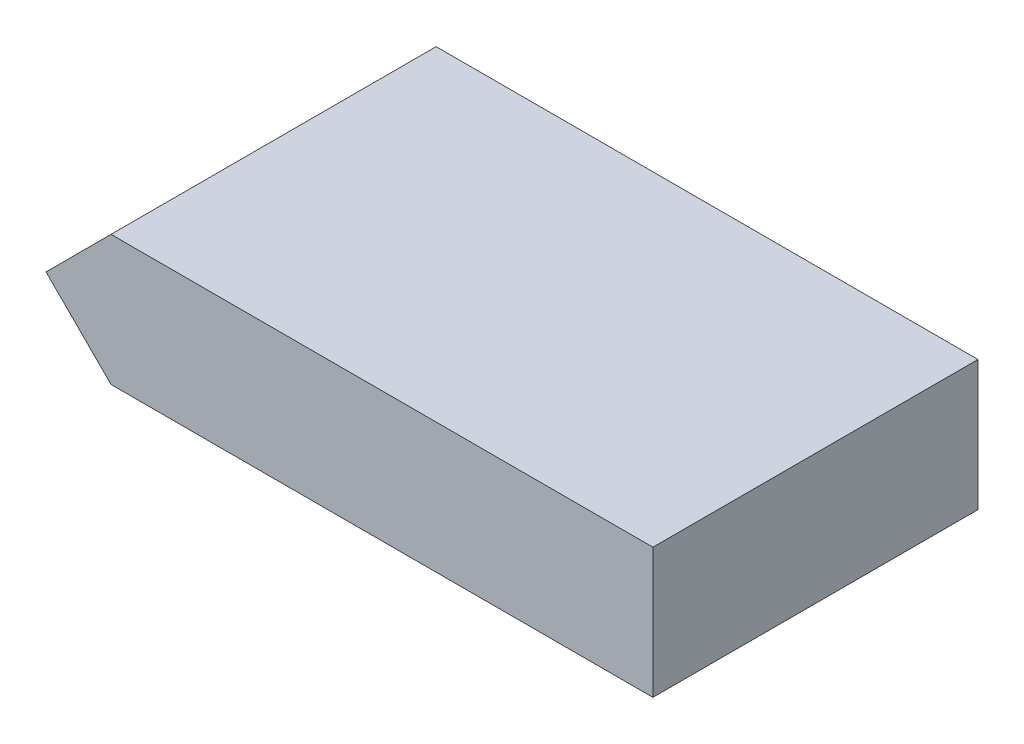
ISO-10303-21;
HEADER;
FILE_DESCRIPTION(('STEP AP214'),'2;1');
FILE_NAME('part.step','',(''),(''),'','','');
FILE_SCHEMA(('AUTOMOTIVE_DESIGN { 1 0 10303 214 1 1 1 1 }'));
ENDSEC;
DATA;
#1=APPLICATION_CONTEXT('core data for automotive mechanical design processes');
#2=APPLICATION_PROTOCOL_DEFINITION('international standard','automotive_design',2000,#1);
#3=PRODUCT_CONTEXT('',#1,'mechanical');
#4=PRODUCT('Part','Part','',(#3));
#5=PRODUCT_RELATED_PRODUCT_CATEGORY('part','',(#4));
#6=PRODUCT_DEFINITION_FORMATION('','',#4);
#7=PRODUCT_DEFINITION_CONTEXT('part definition',#1,'design');
#8=PRODUCT_DEFINITION('design','',#6,#7);
#9=PRODUCT_DEFINITION_SHAPE('','',#8);
#10=(LENGTH_UNIT() NAMED_UNIT(*) SI_UNIT(.MILLI.,.METRE.));
#11=(NAMED_UNIT(*) PLANE_ANGLE_UNIT() SI_UNIT($,.RADIAN.));
#12=(NAMED_UNIT(*) SI_UNIT($,.STERADIAN.) SOLID_ANGLE_UNIT());
#13=UNCERTAINTY_MEASURE_WITH_UNIT(LENGTH_MEASURE(1.E-05),#10,'distance_accuracy_value','');
#14=(GEOMETRIC_REPRESENTATION_CONTEXT(3) GLOBAL_UNCERTAINTY_ASSIGNED_CONTEXT((#13)) GLOBAL_UNIT_ASSIGNED_CONTEXT((#10,
#11,#12)) REPRESENTATION_CONTEXT('',''));
#15=CARTESIAN_POINT('',(0.,0.,0.));
#16=DIRECTION('',(0.,0.,1.));
#17=DIRECTION('',(1.,0.,0.));
#18=AXIS2_PLACEMENT_3D('',#15,#16,#17);
#19=CARTESIAN_POINT('',(0.,0.,15.));
#20=DIRECTION('',(0.707106781186549,0.707106781186546,0.));
#21=DIRECTION('',(-0.707106781186546,0.707106781186549,0.));
#22=AXIS2_PLACEMENT_3D('',#19,#20,#21);
#23=PLANE('',#22);
#24=DIRECTION('',(0.707106781186546,-0.707106781186549,0.));
#25=VECTOR('',#24,1.);
#26=CARTESIAN_POINT('',(0.,0.,-15.));
#27=LINE('',#26,#25);
#28=CARTESIAN_POINT('',(0.,0.,-15.));
#29=VERTEX_POINT('',#28);
#30=CARTESIAN_POINT('',(5.99999999999998,-6.,-15.));
#31=VERTEX_POINT('',#30);
#32=EDGE_CURVE('E120',#29,#31,#27,.T.);
#33=ORIENTED_EDGE('',*,*,#32,.T.);
#34=DIRECTION('',(0.,0.,-1.));
#35=VECTOR('',#34,1.);
#36=CARTESIAN_POINT('',(5.99999999999998,-6.,15.));
#37=LINE('',#36,#35);
#38=CARTESIAN_POINT('',(5.99999999999998,-6.,15.));
#39=VERTEX_POINT('',#38);
#40=EDGE_CURVE('E11',#39,#31,#37,.T.);
#41=ORIENTED_EDGE('',*,*,#40,.F.);
#42=DIRECTION('',(0.707106781186546,-0.707106781186549,0.));
#43=VECTOR('',#42,1.);
#44=CARTESIAN_POINT('',(0.,0.,15.));
#45=LINE('',#44,#43);
#46=CARTESIAN_POINT('',(0.,0.,15.));
#47=VERTEX_POINT('',#46);
#48=EDGE_CURVE('E133',#47,#39,#45,.T.);
#49=ORIENTED_EDGE('',*,*,#48,.F.);
#50=DIRECTION('',(0.,0.,-1.));
#51=VECTOR('',#50,1.);
#52=CARTESIAN_POINT('',(0.,0.,15.));
#53=LINE('',#52,#51);
#54=EDGE_CURVE('E116',#47,#29,#53,.T.);
#55=ORIENTED_EDGE('',*,*,#54,.T.);
#56=EDGE_LOOP('',(#33,#41,#49,#55));
#57=FACE_BOUND('',#56,.T.);
#58=ADVANCED_FACE('F41',(#57),#23,.F.);
#59=CARTESIAN_POINT('',(5.99999999999998,-6.,15.));
#60=DIRECTION('',(0.,1.,0.));
#61=DIRECTION('',(0.,0.,1.));
#62=AXIS2_PLACEMENT_3D('',#59,#60,#61);
#63=PLANE('',#62);
#64=DIRECTION('',(1.,0.,0.));
#65=VECTOR('',#64,1.);
#66=CARTESIAN_POINT('',(5.99999999999998,-6.,-15.));
#67=LINE('',#66,#65);
#68=CARTESIAN_POINT('',(56.,-6.,-15.));
#69=VERTEX_POINT('',#68);
#70=EDGE_CURVE('E124',#31,#69,#67,.T.);
#71=ORIENTED_EDGE('',*,*,#70,.T.);
#72=DIRECTION('',(0.,0.,-1.));
#73=VECTOR('',#72,1.);
#74=CARTESIAN_POINT('',(56.,-6.,15.));
#75=LINE('',#74,#73);
#76=CARTESIAN_POINT('',(56.,-6.,15.));
#77=VERTEX_POINT('',#76);
#78=EDGE_CURVE('E50',#77,#69,#75,.T.);
#79=ORIENTED_EDGE('',*,*,#78,.F.);
#80=DIRECTION('',(1.,0.,0.));
#81=VECTOR('',#80,1.);
#82=CARTESIAN_POINT('',(5.99999999999998,-6.,15.));
#83=LINE('',#82,#81);
#84=EDGE_CURVE('E92',#39,#77,#83,.T.);
#85=ORIENTED_EDGE('',*,*,#84,.F.);
#86=ORIENTED_EDGE('',*,*,#40,.T.);
#87=EDGE_LOOP('',(#71,#79,#85,#86));
#88=FACE_BOUND('',#87,.T.);
#89=ADVANCED_FACE('F155',(#88),#63,.F.);
#90=CARTESIAN_POINT('',(56.,6.,15.));
#91=DIRECTION('',(-1.,0.,0.));
#92=DIRECTION('',(0.,0.,1.));
#93=AXIS2_PLACEMENT_3D('',#90,#91,#92);
#94=PLANE('',#93);
#95=DIRECTION('',(0.,1.,0.));
#96=VECTOR('',#95,1.);
#97=CARTESIAN_POINT('',(56.,6.,-15.));
#98=LINE('',#97,#96);
#99=CARTESIAN_POINT('',(56.,6.,-15.));
#100=VERTEX_POINT('',#99);
#101=EDGE_CURVE('E108',#69,#100,#98,.T.);
#102=ORIENTED_EDGE('',*,*,#101,.T.);
#103=DIRECTION('',(0.,0.,-1.));
#104=VECTOR('',#103,1.);
#105=CARTESIAN_POINT('',(56.,6.,15.));
#106=LINE('',#105,#104);
#107=CARTESIAN_POINT('',(56.,6.,15.));
#108=VERTEX_POINT('',#107);
#109=EDGE_CURVE('E105',#108,#100,#106,.T.);
#110=ORIENTED_EDGE('',*,*,#109,.F.);
#111=DIRECTION('',(0.,1.,0.));
#112=VECTOR('',#111,1.);
#113=CARTESIAN_POINT('',(56.,6.,15.));
#114=LINE('',#113,#112);
#115=EDGE_CURVE('E96',#77,#108,#114,.T.);
#116=ORIENTED_EDGE('',*,*,#115,.F.);
#117=ORIENTED_EDGE('',*,*,#78,.T.);
#118=EDGE_LOOP('',(#102,#110,#116,#117));
#119=FACE_BOUND('',#118,.T.);
#120=ADVANCED_FACE('F106',(#119),#94,.F.);
#121=CARTESIAN_POINT('',(5.99999999999998,6.,15.));
#122=DIRECTION('',(0.,-1.,0.));
#123=DIRECTION('',(0.,0.,-1.));
#124=AXIS2_PLACEMENT_3D('',#121,#122,#123);
#125=PLANE('',#124);
#126=DIRECTION('',(-1.,0.,0.));
#127=VECTOR('',#126,1.);
#128=CARTESIAN_POINT('',(5.99999999999998,6.,-15.));
#129=LINE('',#128,#127);
#130=CARTESIAN_POINT('',(5.99999999999998,6.,-15.));
#131=VERTEX_POINT('',#130);
#132=EDGE_CURVE('E78',#100,#131,#129,.T.);
#133=ORIENTED_EDGE('',*,*,#132,.T.);
#134=DIRECTION('',(0.,0.,-1.));
#135=VECTOR('',#134,1.);
#136=CARTESIAN_POINT('',(5.99999999999998,6.,15.));
#137=LINE('',#136,#135);
#138=CARTESIAN_POINT('',(5.99999999999998,6.,15.));
#139=VERTEX_POINT('',#138);
#140=EDGE_CURVE('E110',#139,#131,#137,.T.);
#141=ORIENTED_EDGE('',*,*,#140,.F.);
#142=DIRECTION('',(-1.,0.,0.));
#143=VECTOR('',#142,1.);
#144=CARTESIAN_POINT('',(5.99999999999998,6.,15.));
#145=LINE('',#144,#143);
#146=EDGE_CURVE('E100',#108,#139,#145,.T.);
#147=ORIENTED_EDGE('',*,*,#146,.F.);
#148=ORIENTED_EDGE('',*,*,#109,.T.);
#149=EDGE_LOOP('',(#133,#141,#147,#148));
#150=FACE_BOUND('',#149,.T.);
#151=ADVANCED_FACE('F112',(#150),#125,.F.);
#152=CARTESIAN_POINT('',(0.,0.,15.));
#153=DIRECTION('',(0.707106781186549,-0.707106781186546,0.));
#154=DIRECTION('',(0.707106781186546,0.707106781186549,0.));
#155=AXIS2_PLACEMENT_3D('',#152,#153,#154);
#156=PLANE('',#155);
#157=DIRECTION('',(-0.707106781186546,-0.707106781186549,0.));
#158=VECTOR('',#157,1.);
#159=CARTESIAN_POINT('',(0.,0.,-15.));
#160=LINE('',#159,#158);
#161=EDGE_CURVE('E84',#131,#29,#160,.T.);
#162=ORIENTED_EDGE('',*,*,#161,.T.);
#163=ORIENTED_EDGE('',*,*,#54,.F.);
#164=DIRECTION('',(-0.707106781186546,-0.707106781186549,0.));
#165=VECTOR('',#164,1.);
#166=CARTESIAN_POINT('',(0.,0.,15.));
#167=LINE('',#166,#165);
#168=EDGE_CURVE('E58',#139,#47,#167,.T.);
#169=ORIENTED_EDGE('',*,*,#168,.F.);
#170=ORIENTED_EDGE('',*,*,#140,.T.);
#171=EDGE_LOOP('',(#162,#163,#169,#170));
#172=FACE_BOUND('',#171,.T.);
#173=ADVANCED_FACE('F144',(#172),#156,.F.);
#174=CARTESIAN_POINT('',(0.,0.,15.));
#175=DIRECTION('',(0.,0.,1.));
#176=DIRECTION('',(1.,0.,0.));
#177=AXIS2_PLACEMENT_3D('',#174,#175,#176);
#178=PLANE('',#177);
#179=ORIENTED_EDGE('',*,*,#48,.T.);
#180=ORIENTED_EDGE('',*,*,#84,.T.);
#181=ORIENTED_EDGE('',*,*,#115,.T.);
#182=ORIENTED_EDGE('',*,*,#146,.T.);
#183=ORIENTED_EDGE('',*,*,#168,.T.);
#184=EDGE_LOOP('',(#179,#180,#181,#182,#183));
#185=FACE_BOUND('',#184,.T.);
#186=ADVANCED_FACE('F98',(#185),#178,.T.);
#187=CARTESIAN_POINT('',(0.,0.,-15.));
#188=DIRECTION('',(0.,0.,1.));
#189=DIRECTION('',(1.,0.,0.));
#190=AXIS2_PLACEMENT_3D('',#187,#188,#189);
#191=PLANE('',#190);
#192=ORIENTED_EDGE('',*,*,#32,.F.);
#193=ORIENTED_EDGE('',*,*,#161,.F.);
#194=ORIENTED_EDGE('',*,*,#132,.F.);
#195=ORIENTED_EDGE('',*,*,#101,.F.);
#196=ORIENTED_EDGE('',*,*,#70,.F.);
#197=EDGE_LOOP('',(#192,#193,#194,#195,#196));
#198=FACE_BOUND('',#197,.T.);
#199=ADVANCED_FACE('F140',(#198),#191,.F.);
#200=CLOSED_SHELL('',(#58,#89,#120,#151,#173,#186,#199));
#201=MANIFOLD_SOLID_BREP('B2',#200);
#202=ADVANCED_BREP_SHAPE_REPRESENTATION('',(#18,#201),#14);
#203=SHAPE_DEFINITION_REPRESENTATION(#9,#202);
ENDSEC;
END-ISO-10303-21;
